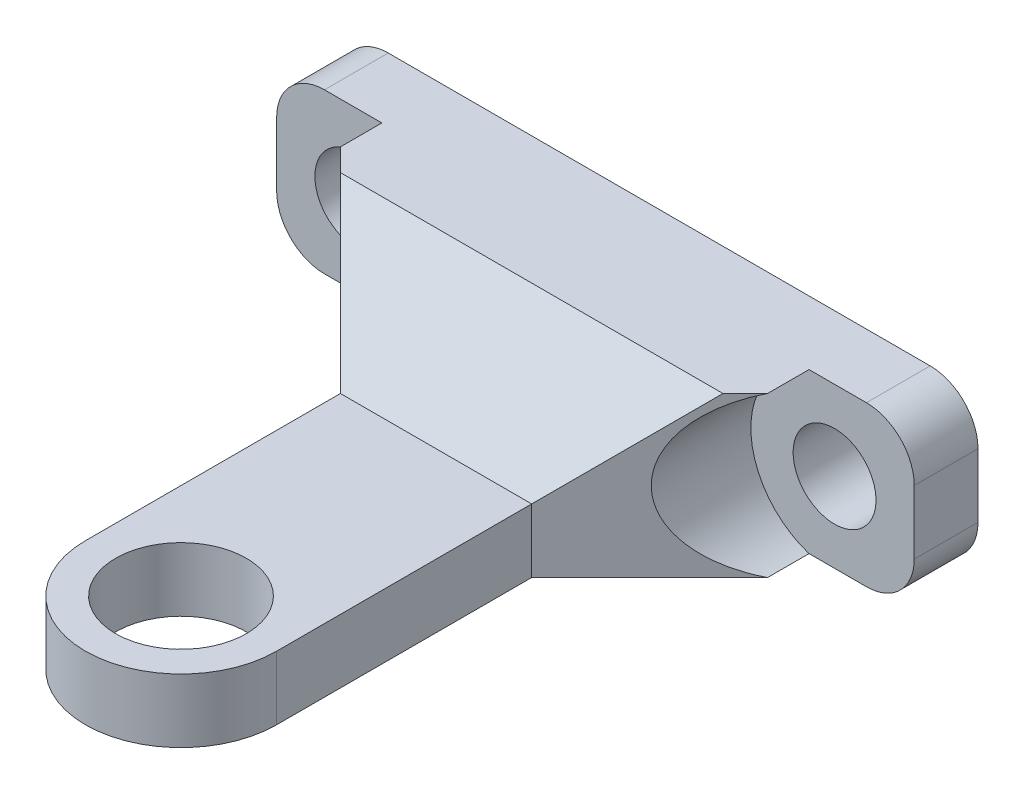
ISO-10303-21;
HEADER;
FILE_DESCRIPTION(('STEP AP214'),'2;1');
FILE_NAME('part.step','',(''),(''),'','','');
FILE_SCHEMA(('AUTOMOTIVE_DESIGN { 1 0 10303 214 1 1 1 1 }'));
ENDSEC;
DATA;
#1=APPLICATION_CONTEXT('core data for automotive mechanical design processes');
#2=APPLICATION_PROTOCOL_DEFINITION('international standard','automotive_design',2000,#1);
#3=PRODUCT_CONTEXT('',#1,'mechanical');
#4=PRODUCT('Part','Part','',(#3));
#5=PRODUCT_RELATED_PRODUCT_CATEGORY('part','',(#4));
#6=PRODUCT_DEFINITION_FORMATION('','',#4);
#7=PRODUCT_DEFINITION_CONTEXT('part definition',#1,'design');
#8=PRODUCT_DEFINITION('design','',#6,#7);
#9=PRODUCT_DEFINITION_SHAPE('','',#8);
#10=(LENGTH_UNIT() NAMED_UNIT(*) SI_UNIT(.MILLI.,.METRE.));
#11=(NAMED_UNIT(*) PLANE_ANGLE_UNIT() SI_UNIT($,.RADIAN.));
#12=(NAMED_UNIT(*) SI_UNIT($,.STERADIAN.) SOLID_ANGLE_UNIT());
#13=UNCERTAINTY_MEASURE_WITH_UNIT(LENGTH_MEASURE(1.E-05),#10,'distance_accuracy_value','');
#14=(GEOMETRIC_REPRESENTATION_CONTEXT(3) GLOBAL_UNCERTAINTY_ASSIGNED_CONTEXT((#13)) GLOBAL_UNIT_ASSIGNED_CONTEXT((#10,
#11,#12)) REPRESENTATION_CONTEXT('',''));
#15=CARTESIAN_POINT('',(0.,0.,0.));
#16=DIRECTION('',(0.,0.,1.));
#17=DIRECTION('',(1.,0.,0.));
#18=AXIS2_PLACEMENT_3D('',#15,#16,#17);
#19=CARTESIAN_POINT('',(15.,3.,-18.));
#20=DIRECTION('',(0.,0.,1.));
#21=DIRECTION('',(1.,0.,0.));
#22=AXIS2_PLACEMENT_3D('',#19,#20,#21);
#23=CYLINDRICAL_SURFACE('',#22,2.6);
#24=CARTESIAN_POINT('',(15.,3.,-18.));
#25=DIRECTION('',(0.,0.,-1.));
#26=DIRECTION('',(-1.,0.,0.));
#27=AXIS2_PLACEMENT_3D('',#24,#25,#26);
#28=CIRCLE('',#27,2.6);
#29=CARTESIAN_POINT('',(12.4,3.,-18.));
#30=VERTEX_POINT('',#29);
#31=EDGE_CURVE('E182',#30,#30,#28,.T.);
#32=ORIENTED_EDGE('',*,*,#31,.T.);
#33=EDGE_LOOP('',(#32));
#34=FACE_BOUND('',#33,.T.);
#35=CARTESIAN_POINT('',(15.,3.,-14.));
#36=DIRECTION('',(0.,0.,-1.));
#37=DIRECTION('',(-1.,0.,0.));
#38=AXIS2_PLACEMENT_3D('',#35,#36,#37);
#39=CIRCLE('',#38,2.6);
#40=CARTESIAN_POINT('',(12.4,3.,-14.));
#41=VERTEX_POINT('',#40);
#42=EDGE_CURVE('E187',#41,#41,#39,.F.);
#43=ORIENTED_EDGE('',*,*,#42,.T.);
#44=EDGE_LOOP('',(#43));
#45=FACE_BOUND('',#44,.T.);
#46=ADVANCED_FACE('F35',(#34,#45),#23,.F.);
#47=CARTESIAN_POINT('',(0.,-2.,0.));
#48=DIRECTION('',(0.,1.,0.));
#49=DIRECTION('',(0.,0.,1.));
#50=AXIS2_PLACEMENT_3D('',#47,#48,#49);
#51=PLANE('',#50);
#52=CARTESIAN_POINT('',(0.,-2.,12.));
#53=DIRECTION('',(0.,1.,0.));
#54=DIRECTION('',(0.,0.,1.));
#55=AXIS2_PLACEMENT_3D('',#52,#53,#54);
#56=CIRCLE('',#55,4.1);
#57=CARTESIAN_POINT('',(0.,-2.,16.1));
#58=VERTEX_POINT('',#57);
#59=EDGE_CURVE('E211',#58,#58,#56,.T.);
#60=ORIENTED_EDGE('',*,*,#59,.T.);
#61=EDGE_LOOP('',(#60));
#62=FACE_BOUND('',#61,.T.);
#63=DIRECTION('',(1.,0.,0.));
#64=VECTOR('',#63,1.);
#65=CARTESIAN_POINT('',(0.,-2.,-18.));
#66=LINE('',#65,#64);
#67=CARTESIAN_POINT('',(-17.,-2.,-18.));
#68=VERTEX_POINT('',#67);
#69=CARTESIAN_POINT('',(17.,-2.,-18.));
#70=VERTEX_POINT('',#69);
#71=EDGE_CURVE('E230',#68,#70,#66,.T.);
#72=ORIENTED_EDGE('',*,*,#71,.T.);
#73=DIRECTION('',(0.,0.,1.));
#74=VECTOR('',#73,1.);
#75=CARTESIAN_POINT('',(17.,-2.,-14.));
#76=LINE('',#75,#74);
#77=CARTESIAN_POINT('',(17.,-2.,-14.));
#78=VERTEX_POINT('',#77);
#79=EDGE_CURVE('E280',#70,#78,#76,.T.);
#80=ORIENTED_EDGE('',*,*,#79,.T.);
#81=DIRECTION('',(1.,0.,0.));
#82=VECTOR('',#81,1.);
#83=CARTESIAN_POINT('',(0.,-2.,-14.));
#84=LINE('',#83,#82);
#85=CARTESIAN_POINT('',(13.3992189406418,-2.,-14.));
#86=VERTEX_POINT('',#85);
#87=EDGE_CURVE('E222',#86,#78,#84,.T.);
#88=ORIENTED_EDGE('',*,*,#87,.F.);
#89=DIRECTION('',(0.,0.,-1.));
#90=VECTOR('',#89,1.);
#91=CARTESIAN_POINT('',(13.3992189406418,-2.,18.));
#92=LINE('',#91,#90);
#93=CARTESIAN_POINT('',(13.3992189406418,-2.,-11.3992189406418));
#94=VERTEX_POINT('',#93);
#95=EDGE_CURVE('E175',#86,#94,#92,.F.);
#96=ORIENTED_EDGE('',*,*,#95,.T.);
#97=DIRECTION('',(0.707106781186551,0.,-0.707106781186544));
#98=VECTOR('',#97,1.);
#99=CARTESIAN_POINT('',(0.999999999999946,-2.,0.999999999999956));
#100=LINE('',#99,#98);
#101=CARTESIAN_POINT('',(6.,-2.,-4.00000000000005));
#102=VERTEX_POINT('',#101);
#103=EDGE_CURVE('E253',#94,#102,#100,.F.);
#104=ORIENTED_EDGE('',*,*,#103,.T.);
#105=DIRECTION('',(0.,0.,-1.));
#106=VECTOR('',#105,1.);
#107=CARTESIAN_POINT('',(6.,-2.,0.));
#108=LINE('',#107,#106);
#109=CARTESIAN_POINT('',(6.,-2.,12.));
#110=VERTEX_POINT('',#109);
#111=EDGE_CURVE('E227',#110,#102,#108,.T.);
#112=ORIENTED_EDGE('',*,*,#111,.F.);
#113=CARTESIAN_POINT('',(0.,-2.,12.));
#114=DIRECTION('',(0.,1.,0.));
#115=DIRECTION('',(0.,0.,1.));
#116=AXIS2_PLACEMENT_3D('',#113,#114,#115);
#117=CIRCLE('',#116,6.);
#118=CARTESIAN_POINT('',(-6.,-2.,12.));
#119=VERTEX_POINT('',#118);
#120=EDGE_CURVE('E225',#119,#110,#117,.T.);
#121=ORIENTED_EDGE('',*,*,#120,.F.);
#122=DIRECTION('',(0.,0.,-1.));
#123=VECTOR('',#122,1.);
#124=CARTESIAN_POINT('',(-6.,-2.,0.));
#125=LINE('',#124,#123);
#126=CARTESIAN_POINT('',(-6.,-2.,-4.00000000000003));
#127=VERTEX_POINT('',#126);
#128=EDGE_CURVE('E221',#119,#127,#125,.T.);
#129=ORIENTED_EDGE('',*,*,#128,.T.);
#130=DIRECTION('',(-0.707106781186551,0.,-0.707106781186544));
#131=VECTOR('',#130,1.);
#132=CARTESIAN_POINT('',(-0.999999999999952,-2.,0.999999999999962));
#133=LINE('',#132,#131);
#134=CARTESIAN_POINT('',(-13.3992189406418,-2.,-11.3992189406418));
#135=VERTEX_POINT('',#134);
#136=EDGE_CURVE('E258',#127,#135,#133,.T.);
#137=ORIENTED_EDGE('',*,*,#136,.T.);
#138=DIRECTION('',(0.,0.,-1.));
#139=VECTOR('',#138,1.);
#140=CARTESIAN_POINT('',(-13.3992189406418,-2.,18.));
#141=LINE('',#140,#139);
#142=CARTESIAN_POINT('',(-13.3992189406418,-2.,-14.));
#143=VERTEX_POINT('',#142);
#144=EDGE_CURVE('E196',#143,#135,#141,.F.);
#145=ORIENTED_EDGE('',*,*,#144,.F.);
#146=CARTESIAN_POINT('',(-17.,-2.,-14.));
#147=VERTEX_POINT('',#146);
#148=EDGE_CURVE('E206',#147,#143,#84,.T.);
#149=ORIENTED_EDGE('',*,*,#148,.F.);
#150=DIRECTION('',(0.,0.,1.));
#151=VECTOR('',#150,1.);
#152=CARTESIAN_POINT('',(-17.,-2.,0.));
#153=LINE('',#152,#151);
#154=EDGE_CURVE('E278',#147,#68,#153,.F.);
#155=ORIENTED_EDGE('',*,*,#154,.T.);
#156=EDGE_LOOP('',(#72,#80,#88,#96,#104,#112,#121,#129,#137,#145,#149,#155));
#157=FACE_BOUND('',#156,.T.);
#158=ADVANCED_FACE('F317',(#62,#157),#51,.F.);
#159=CARTESIAN_POINT('',(0.,8.,0.));
#160=DIRECTION('',(0.,1.,0.));
#161=DIRECTION('',(0.,0.,1.));
#162=AXIS2_PLACEMENT_3D('',#159,#160,#161);
#163=PLANE('',#162);
#164=DIRECTION('',(1.,0.,0.));
#165=VECTOR('',#164,1.);
#166=CARTESIAN_POINT('',(-20.,8.,-14.));
#167=LINE('',#166,#165);
#168=CARTESIAN_POINT('',(13.3992189406418,8.,-14.));
#169=VERTEX_POINT('',#168);
#170=CARTESIAN_POINT('',(17.,8.,-14.));
#171=VERTEX_POINT('',#170);
#172=EDGE_CURVE('E153',#169,#171,#167,.T.);
#173=ORIENTED_EDGE('',*,*,#172,.T.);
#174=DIRECTION('',(0.,0.,-1.));
#175=VECTOR('',#174,1.);
#176=CARTESIAN_POINT('',(17.,8.,0.));
#177=LINE('',#176,#175);
#178=CARTESIAN_POINT('',(17.,8.,-18.));
#179=VERTEX_POINT('',#178);
#180=EDGE_CURVE('E301',#171,#179,#177,.T.);
#181=ORIENTED_EDGE('',*,*,#180,.T.);
#182=DIRECTION('',(-1.,0.,0.));
#183=VECTOR('',#182,1.);
#184=CARTESIAN_POINT('',(-20.,8.,-18.));
#185=LINE('',#184,#183);
#186=CARTESIAN_POINT('',(-17.,8.,-18.));
#187=VERTEX_POINT('',#186);
#188=EDGE_CURVE('E203',#179,#187,#185,.T.);
#189=ORIENTED_EDGE('',*,*,#188,.T.);
#190=DIRECTION('',(0.,0.,1.));
#191=VECTOR('',#190,1.);
#192=CARTESIAN_POINT('',(-17.,8.,-14.));
#193=LINE('',#192,#191);
#194=CARTESIAN_POINT('',(-17.,8.,-14.));
#195=VERTEX_POINT('',#194);
#196=EDGE_CURVE('E298',#187,#195,#193,.T.);
#197=ORIENTED_EDGE('',*,*,#196,.T.);
#198=CARTESIAN_POINT('',(-13.3992189406418,8.,-14.));
#199=VERTEX_POINT('',#198);
#200=EDGE_CURVE('E166',#195,#199,#167,.T.);
#201=ORIENTED_EDGE('',*,*,#200,.T.);
#202=DIRECTION('',(0.,0.,-1.));
#203=VECTOR('',#202,1.);
#204=CARTESIAN_POINT('',(-13.3992189406418,8.,18.));
#205=LINE('',#204,#203);
#206=CARTESIAN_POINT('',(-13.3992189406418,8.,-11.3992189406418));
#207=VERTEX_POINT('',#206);
#208=EDGE_CURVE('E193',#199,#207,#205,.F.);
#209=ORIENTED_EDGE('',*,*,#208,.T.);
#210=DIRECTION('',(0.707106781186551,0.,0.707106781186544));
#211=VECTOR('',#210,1.);
#212=CARTESIAN_POINT('',(-6.,8.,-4.00000000000003));
#213=LINE('',#212,#211);
#214=CARTESIAN_POINT('',(-11.9999999999999,8.,-9.99999999999987));
#215=VERTEX_POINT('',#214);
#216=EDGE_CURVE('E271',#207,#215,#213,.T.);
#217=ORIENTED_EDGE('',*,*,#216,.T.);
#218=DIRECTION('',(1.,0.,0.));
#219=VECTOR('',#218,1.);
#220=CARTESIAN_POINT('',(0.,8.,-9.99999999999987));
#221=LINE('',#220,#219);
#222=CARTESIAN_POINT('',(11.9999999999999,8.,-9.99999999999987));
#223=VERTEX_POINT('',#222);
#224=EDGE_CURVE('E264',#215,#223,#221,.T.);
#225=ORIENTED_EDGE('',*,*,#224,.T.);
#226=DIRECTION('',(-0.707106781186551,0.,0.707106781186544));
#227=VECTOR('',#226,1.);
#228=CARTESIAN_POINT('',(16.0000000000001,8.,-14.));
#229=LINE('',#228,#227);
#230=CARTESIAN_POINT('',(13.3992189406418,8.,-11.3992189406418));
#231=VERTEX_POINT('',#230);
#232=EDGE_CURVE('E180',#231,#223,#229,.T.);
#233=ORIENTED_EDGE('',*,*,#232,.F.);
#234=DIRECTION('',(0.,0.,-1.));
#235=VECTOR('',#234,1.);
#236=CARTESIAN_POINT('',(13.3992189406418,8.,18.));
#237=LINE('',#236,#235);
#238=EDGE_CURVE('E172',#169,#231,#237,.F.);
#239=ORIENTED_EDGE('',*,*,#238,.F.);
#240=EDGE_LOOP('',(#173,#181,#189,#197,#201,#209,#217,#225,#233,#239));
#241=FACE_BOUND('',#240,.T.);
#242=ADVANCED_FACE('F178',(#241),#163,.T.);
#243=CARTESIAN_POINT('',(-6.,2.,-4.00000000000003));
#244=DIRECTION('',(0.707106781186544,0.,-0.707106781186551));
#245=DIRECTION('',(0.,-1.,0.));
#246=AXIS2_PLACEMENT_3D('',#243,#244,#245);
#247=PLANE('',#246);
#248=CARTESIAN_POINT('',(-15.,3.,-12.9999999999999));
#249=DIRECTION('',(0.707106781186544,0.,-0.707106781186551));
#250=DIRECTION('',(-0.707106781186551,0.,-0.707106781186544));
#251=AXIS2_PLACEMENT_3D('',#248,#249,#250);
#252=ELLIPSE('',#251,7.42462120245871,5.25);
#253=EDGE_CURVE('E273',#135,#207,#252,.F.);
#254=ORIENTED_EDGE('',*,*,#253,.F.);
#255=ORIENTED_EDGE('',*,*,#136,.F.);
#256=DIRECTION('',(0.,-1.,0.));
#257=VECTOR('',#256,1.);
#258=CARTESIAN_POINT('',(-6.,2.,-4.00000000000003));
#259=LINE('',#258,#257);
#260=CARTESIAN_POINT('',(-6.,2.,-4.00000000000003));
#261=VERTEX_POINT('',#260);
#262=EDGE_CURVE('E255',#261,#127,#259,.T.);
#263=ORIENTED_EDGE('',*,*,#262,.F.);
#264=DIRECTION('',(-0.577350269189628,0.577350269189628,-0.577350269189622));
#265=VECTOR('',#264,1.);
#266=CARTESIAN_POINT('',(-5.99999999999996,2.00000000000007,-4.));
#267=LINE('',#266,#265);
#268=EDGE_CURVE('E268',#261,#215,#267,.T.);
#269=ORIENTED_EDGE('',*,*,#268,.T.);
#270=ORIENTED_EDGE('',*,*,#216,.F.);
#271=EDGE_LOOP('',(#254,#255,#263,#269,#270));
#272=FACE_BOUND('',#271,.T.);
#273=ADVANCED_FACE('F343',(#272),#247,.F.);
#274=CARTESIAN_POINT('',(-15.,3.,-18.));
#275=DIRECTION('',(0.,0.,1.));
#276=DIRECTION('',(1.,0.,0.));
#277=AXIS2_PLACEMENT_3D('',#274,#275,#276);
#278=CYLINDRICAL_SURFACE('',#277,2.6);
#279=CARTESIAN_POINT('',(-15.,3.,-18.));
#280=DIRECTION('',(0.,0.,1.));
#281=DIRECTION('',(1.,0.,0.));
#282=AXIS2_PLACEMENT_3D('',#279,#280,#281);
#283=CIRCLE('',#282,2.6);
#284=CARTESIAN_POINT('',(-12.4,3.,-18.));
#285=VERTEX_POINT('',#284);
#286=EDGE_CURVE('E198',#285,#285,#283,.T.);
#287=ORIENTED_EDGE('',*,*,#286,.F.);
#288=EDGE_LOOP('',(#287));
#289=FACE_BOUND('',#288,.T.);
#290=CARTESIAN_POINT('',(-15.,3.,-14.));
#291=DIRECTION('',(0.,0.,-1.));
#292=DIRECTION('',(-1.,0.,0.));
#293=AXIS2_PLACEMENT_3D('',#290,#291,#292);
#294=CIRCLE('',#293,2.6);
#295=CARTESIAN_POINT('',(-17.6,3.,-14.));
#296=VERTEX_POINT('',#295);
#297=EDGE_CURVE('E167',#296,#296,#294,.T.);
#298=ORIENTED_EDGE('',*,*,#297,.F.);
#299=EDGE_LOOP('',(#298));
#300=FACE_BOUND('',#299,.T.);
#301=ADVANCED_FACE('F391',(#289,#300),#278,.F.);
#302=CARTESIAN_POINT('',(0.,2.,-14.));
#303=DIRECTION('',(0.,0.,-1.));
#304=DIRECTION('',(-1.,0.,0.));
#305=AXIS2_PLACEMENT_3D('',#302,#303,#304);
#306=PLANE('',#305);
#307=ORIENTED_EDGE('',*,*,#87,.T.);
#308=CARTESIAN_POINT('',(17.,1.,-14.));
#309=DIRECTION('',(0.,0.,-1.));
#310=DIRECTION('',(-1.,0.,0.));
#311=AXIS2_PLACEMENT_3D('',#308,#309,#310);
#312=CIRCLE('',#311,3.);
#313=CARTESIAN_POINT('',(20.,1.,-14.));
#314=VERTEX_POINT('',#313);
#315=EDGE_CURVE('E284',#78,#314,#312,.F.);
#316=ORIENTED_EDGE('',*,*,#315,.T.);
#317=DIRECTION('',(0.,-1.,0.));
#318=VECTOR('',#317,1.);
#319=CARTESIAN_POINT('',(20.,2.,-14.));
#320=LINE('',#319,#318);
#321=CARTESIAN_POINT('',(20.,5.,-14.));
#322=VERTEX_POINT('',#321);
#323=EDGE_CURVE('E240',#322,#314,#320,.T.);
#324=ORIENTED_EDGE('',*,*,#323,.F.);
#325=CARTESIAN_POINT('',(17.,5.,-14.));
#326=DIRECTION('',(0.,0.,-1.));
#327=DIRECTION('',(-1.,0.,0.));
#328=AXIS2_PLACEMENT_3D('',#325,#326,#327);
#329=CIRCLE('',#328,3.);
#330=EDGE_CURVE('E161',#322,#171,#329,.F.);
#331=ORIENTED_EDGE('',*,*,#330,.T.);
#332=ORIENTED_EDGE('',*,*,#172,.F.);
#333=CARTESIAN_POINT('',(15.,3.,-14.));
#334=DIRECTION('',(0.,0.,-1.));
#335=DIRECTION('',(-1.,0.,0.));
#336=AXIS2_PLACEMENT_3D('',#333,#334,#335);
#337=CIRCLE('',#336,5.25);
#338=EDGE_CURVE('E158',#86,#169,#337,.T.);
#339=ORIENTED_EDGE('',*,*,#338,.F.);
#340=EDGE_LOOP('',(#307,#316,#324,#331,#332,#339));
#341=FACE_BOUND('',#340,.T.);
#342=ORIENTED_EDGE('',*,*,#42,.F.);
#343=EDGE_LOOP('',(#342));
#344=FACE_BOUND('',#343,.T.);
#345=ADVANCED_FACE('F156',(#341,#344),#306,.F.);
#346=CARTESIAN_POINT('',(-20.,2.,0.));
#347=DIRECTION('',(1.,0.,0.));
#348=DIRECTION('',(0.,0.,-1.));
#349=AXIS2_PLACEMENT_3D('',#346,#347,#348);
#350=PLANE('',#349);
#351=DIRECTION('',(0.,-1.,0.));
#352=VECTOR('',#351,1.);
#353=CARTESIAN_POINT('',(-20.,2.,-18.));
#354=LINE('',#353,#352);
#355=CARTESIAN_POINT('',(-20.,5.,-18.));
#356=VERTEX_POINT('',#355);
#357=CARTESIAN_POINT('',(-20.,1.,-18.));
#358=VERTEX_POINT('',#357);
#359=EDGE_CURVE('E219',#356,#358,#354,.T.);
#360=ORIENTED_EDGE('',*,*,#359,.T.);
#361=DIRECTION('',(0.,0.,1.));
#362=VECTOR('',#361,1.);
#363=CARTESIAN_POINT('',(-20.,1.,0.));
#364=LINE('',#363,#362);
#365=CARTESIAN_POINT('',(-20.,1.,-14.));
#366=VERTEX_POINT('',#365);
#367=EDGE_CURVE('E305',#358,#366,#364,.T.);
#368=ORIENTED_EDGE('',*,*,#367,.T.);
#369=DIRECTION('',(0.,-1.,0.));
#370=VECTOR('',#369,1.);
#371=CARTESIAN_POINT('',(-20.,2.,-14.));
#372=LINE('',#371,#370);
#373=CARTESIAN_POINT('',(-20.,5.,-14.));
#374=VERTEX_POINT('',#373);
#375=EDGE_CURVE('E248',#374,#366,#372,.T.);
#376=ORIENTED_EDGE('',*,*,#375,.F.);
#377=DIRECTION('',(0.,0.,1.));
#378=VECTOR('',#377,1.);
#379=CARTESIAN_POINT('',(-20.,5.,-18.));
#380=LINE('',#379,#378);
#381=EDGE_CURVE('E303',#374,#356,#380,.F.);
#382=ORIENTED_EDGE('',*,*,#381,.T.);
#383=EDGE_LOOP('',(#360,#368,#376,#382));
#384=FACE_BOUND('',#383,.T.);
#385=ADVANCED_FACE('F307',(#384),#350,.F.);
#386=CARTESIAN_POINT('',(-6.,2.,0.));
#387=DIRECTION('',(-1.,0.,0.));
#388=DIRECTION('',(0.,0.,1.));
#389=AXIS2_PLACEMENT_3D('',#386,#387,#388);
#390=PLANE('',#389);
#391=DIRECTION('',(0.,0.,-1.));
#392=VECTOR('',#391,1.);
#393=CARTESIAN_POINT('',(-6.,2.,0.));
#394=LINE('',#393,#392);
#395=CARTESIAN_POINT('',(-6.,2.,12.));
#396=VERTEX_POINT('',#395);
#397=EDGE_CURVE('E207',#396,#261,#394,.T.);
#398=ORIENTED_EDGE('',*,*,#397,.T.);
#399=ORIENTED_EDGE('',*,*,#262,.T.);
#400=ORIENTED_EDGE('',*,*,#128,.F.);
#401=DIRECTION('',(0.,-1.,0.));
#402=VECTOR('',#401,1.);
#403=CARTESIAN_POINT('',(-6.,2.,12.));
#404=LINE('',#403,#402);
#405=EDGE_CURVE('E246',#396,#119,#404,.T.);
#406=ORIENTED_EDGE('',*,*,#405,.F.);
#407=EDGE_LOOP('',(#398,#399,#400,#406));
#408=FACE_BOUND('',#407,.T.);
#409=ADVANCED_FACE('F369',(#408),#390,.T.);
#410=CARTESIAN_POINT('',(0.,2.,12.));
#411=DIRECTION('',(0.,-1.,0.));
#412=DIRECTION('',(0.,0.,-1.));
#413=AXIS2_PLACEMENT_3D('',#410,#411,#412);
#414=CYLINDRICAL_SURFACE('',#413,6.);
#415=ORIENTED_EDGE('',*,*,#120,.T.);
#416=DIRECTION('',(0.,-1.,0.));
#417=VECTOR('',#416,1.);
#418=CARTESIAN_POINT('',(6.,2.,12.));
#419=LINE('',#418,#417);
#420=CARTESIAN_POINT('',(6.,2.,12.));
#421=VERTEX_POINT('',#420);
#422=EDGE_CURVE('E243',#421,#110,#419,.T.);
#423=ORIENTED_EDGE('',*,*,#422,.F.);
#424=CARTESIAN_POINT('',(0.,2.,12.));
#425=DIRECTION('',(0.,1.,0.));
#426=DIRECTION('',(0.,0.,1.));
#427=AXIS2_PLACEMENT_3D('',#424,#425,#426);
#428=CIRCLE('',#427,6.);
#429=EDGE_CURVE('E210',#396,#421,#428,.T.);
#430=ORIENTED_EDGE('',*,*,#429,.F.);
#431=ORIENTED_EDGE('',*,*,#405,.T.);
#432=EDGE_LOOP('',(#415,#423,#430,#431));
#433=FACE_BOUND('',#432,.T.);
#434=ADVANCED_FACE('F365',(#433),#414,.T.);
#435=CARTESIAN_POINT('',(6.,2.,0.));
#436=DIRECTION('',(-1.,0.,0.));
#437=DIRECTION('',(0.,0.,1.));
#438=AXIS2_PLACEMENT_3D('',#435,#436,#437);
#439=PLANE('',#438);
#440=ORIENTED_EDGE('',*,*,#111,.T.);
#441=DIRECTION('',(0.,1.,0.));
#442=VECTOR('',#441,1.);
#443=CARTESIAN_POINT('',(6.,2.,-4.00000000000005));
#444=LINE('',#443,#442);
#445=CARTESIAN_POINT('',(6.,2.,-4.00000000000005));
#446=VERTEX_POINT('',#445);
#447=EDGE_CURVE('E250',#102,#446,#444,.T.);
#448=ORIENTED_EDGE('',*,*,#447,.T.);
#449=DIRECTION('',(0.,0.,-1.));
#450=VECTOR('',#449,1.);
#451=CARTESIAN_POINT('',(6.,2.,0.));
#452=LINE('',#451,#450);
#453=EDGE_CURVE('E213',#421,#446,#452,.T.);
#454=ORIENTED_EDGE('',*,*,#453,.F.);
#455=ORIENTED_EDGE('',*,*,#422,.T.);
#456=EDGE_LOOP('',(#440,#448,#454,#455));
#457=FACE_BOUND('',#456,.T.);
#458=ADVANCED_FACE('F356',(#457),#439,.F.);
#459=ORIENTED_EDGE('',*,*,#375,.T.);
#460=CARTESIAN_POINT('',(-17.,1.,-14.));
#461=DIRECTION('',(0.,0.,-1.));
#462=DIRECTION('',(-1.,0.,0.));
#463=AXIS2_PLACEMENT_3D('',#460,#461,#462);
#464=CIRCLE('',#463,3.);
#465=EDGE_CURVE('E11',#366,#147,#464,.F.);
#466=ORIENTED_EDGE('',*,*,#465,.T.);
#467=ORIENTED_EDGE('',*,*,#148,.T.);
#468=CARTESIAN_POINT('',(-15.,3.,-14.));
#469=DIRECTION('',(0.,0.,1.));
#470=DIRECTION('',(1.,0.,0.));
#471=AXIS2_PLACEMENT_3D('',#468,#469,#470);
#472=CIRCLE('',#471,5.25);
#473=EDGE_CURVE('E190',#143,#199,#472,.T.);
#474=ORIENTED_EDGE('',*,*,#473,.T.);
#475=ORIENTED_EDGE('',*,*,#200,.F.);
#476=CARTESIAN_POINT('',(-17.,5.,-14.));
#477=DIRECTION('',(0.,0.,-1.));
#478=DIRECTION('',(-1.,0.,0.));
#479=AXIS2_PLACEMENT_3D('',#476,#477,#478);
#480=CIRCLE('',#479,3.);
#481=EDGE_CURVE('E43',#195,#374,#480,.F.);
#482=ORIENTED_EDGE('',*,*,#481,.T.);
#483=EDGE_LOOP('',(#459,#466,#467,#474,#475,#482));
#484=FACE_BOUND('',#483,.T.);
#485=ORIENTED_EDGE('',*,*,#297,.T.);
#486=EDGE_LOOP('',(#485));
#487=FACE_BOUND('',#486,.T.);
#488=ADVANCED_FACE('F311',(#484,#487),#306,.F.);
#489=CARTESIAN_POINT('',(20.,2.,0.));
#490=DIRECTION('',(1.,0.,0.));
#491=DIRECTION('',(0.,0.,-1.));
#492=AXIS2_PLACEMENT_3D('',#489,#490,#491);
#493=PLANE('',#492);
#494=ORIENTED_EDGE('',*,*,#323,.T.);
#495=DIRECTION('',(0.,0.,1.));
#496=VECTOR('',#495,1.);
#497=CARTESIAN_POINT('',(20.,1.,-18.));
#498=LINE('',#497,#496);
#499=CARTESIAN_POINT('',(20.,1.,-18.));
#500=VERTEX_POINT('',#499);
#501=EDGE_CURVE('E288',#314,#500,#498,.F.);
#502=ORIENTED_EDGE('',*,*,#501,.T.);
#503=DIRECTION('',(0.,-1.,0.));
#504=VECTOR('',#503,1.);
#505=CARTESIAN_POINT('',(20.,2.,-18.));
#506=LINE('',#505,#504);
#507=CARTESIAN_POINT('',(20.,5.,-18.));
#508=VERTEX_POINT('',#507);
#509=EDGE_CURVE('E237',#508,#500,#506,.T.);
#510=ORIENTED_EDGE('',*,*,#509,.F.);
#511=DIRECTION('',(0.,0.,-1.));
#512=VECTOR('',#511,1.);
#513=CARTESIAN_POINT('',(20.,5.,0.));
#514=LINE('',#513,#512);
#515=EDGE_CURVE('E286',#508,#322,#514,.F.);
#516=ORIENTED_EDGE('',*,*,#515,.T.);
#517=EDGE_LOOP('',(#494,#502,#510,#516));
#518=FACE_BOUND('',#517,.T.);
#519=ADVANCED_FACE('F329',(#518),#493,.T.);
#520=CARTESIAN_POINT('',(0.,2.,-18.));
#521=DIRECTION('',(0.,0.,-1.));
#522=DIRECTION('',(-1.,0.,0.));
#523=AXIS2_PLACEMENT_3D('',#520,#521,#522);
#524=PLANE('',#523);
#525=ORIENTED_EDGE('',*,*,#31,.F.);
#526=EDGE_LOOP('',(#525));
#527=FACE_BOUND('',#526,.T.);
#528=ORIENTED_EDGE('',*,*,#286,.T.);
#529=EDGE_LOOP('',(#528));
#530=FACE_BOUND('',#529,.T.);
#531=ORIENTED_EDGE('',*,*,#509,.T.);
#532=CARTESIAN_POINT('',(17.,1.,-18.));
#533=DIRECTION('',(0.,0.,-1.));
#534=DIRECTION('',(-1.,0.,0.));
#535=AXIS2_PLACEMENT_3D('',#532,#533,#534);
#536=CIRCLE('',#535,3.);
#537=EDGE_CURVE('E296',#500,#70,#536,.T.);
#538=ORIENTED_EDGE('',*,*,#537,.T.);
#539=ORIENTED_EDGE('',*,*,#71,.F.);
#540=CARTESIAN_POINT('',(-17.,1.,-18.));
#541=DIRECTION('',(0.,0.,-1.));
#542=DIRECTION('',(-1.,0.,0.));
#543=AXIS2_PLACEMENT_3D('',#540,#541,#542);
#544=CIRCLE('',#543,3.);
#545=EDGE_CURVE('E292',#68,#358,#544,.T.);
#546=ORIENTED_EDGE('',*,*,#545,.T.);
#547=ORIENTED_EDGE('',*,*,#359,.F.);
#548=CARTESIAN_POINT('',(-17.,5.,-18.));
#549=DIRECTION('',(0.,0.,-1.));
#550=DIRECTION('',(-1.,0.,0.));
#551=AXIS2_PLACEMENT_3D('',#548,#549,#550);
#552=CIRCLE('',#551,3.);
#553=EDGE_CURVE('E290',#356,#187,#552,.T.);
#554=ORIENTED_EDGE('',*,*,#553,.T.);
#555=ORIENTED_EDGE('',*,*,#188,.F.);
#556=CARTESIAN_POINT('',(17.,5.,-18.));
#557=DIRECTION('',(0.,0.,-1.));
#558=DIRECTION('',(-1.,0.,0.));
#559=AXIS2_PLACEMENT_3D('',#556,#557,#558);
#560=CIRCLE('',#559,3.);
#561=EDGE_CURVE('E294',#179,#508,#560,.T.);
#562=ORIENTED_EDGE('',*,*,#561,.T.);
#563=EDGE_LOOP('',(#531,#538,#539,#546,#547,#554,#555,#562));
#564=FACE_BOUND('',#563,.T.);
#565=ADVANCED_FACE('F321',(#527,#530,#564),#524,.T.);
#566=CARTESIAN_POINT('',(0.,2.,12.));
#567=DIRECTION('',(0.,-1.,0.));
#568=DIRECTION('',(0.,0.,-1.));
#569=AXIS2_PLACEMENT_3D('',#566,#567,#568);
#570=CYLINDRICAL_SURFACE('',#569,4.1);
#571=CARTESIAN_POINT('',(0.,2.,12.));
#572=DIRECTION('',(0.,1.,0.));
#573=DIRECTION('',(0.,0.,1.));
#574=AXIS2_PLACEMENT_3D('',#571,#572,#573);
#575=CIRCLE('',#574,4.1);
#576=CARTESIAN_POINT('',(0.,2.,16.1));
#577=VERTEX_POINT('',#576);
#578=EDGE_CURVE('E216',#577,#577,#575,.T.);
#579=ORIENTED_EDGE('',*,*,#578,.T.);
#580=EDGE_LOOP('',(#579));
#581=FACE_BOUND('',#580,.T.);
#582=ORIENTED_EDGE('',*,*,#59,.F.);
#583=EDGE_LOOP('',(#582));
#584=FACE_BOUND('',#583,.T.);
#585=ADVANCED_FACE('F398',(#581,#584),#570,.F.);
#586=CARTESIAN_POINT('',(0.,2.,0.));
#587=DIRECTION('',(0.,1.,0.));
#588=DIRECTION('',(0.,0.,1.));
#589=AXIS2_PLACEMENT_3D('',#586,#587,#588);
#590=PLANE('',#589);
#591=ORIENTED_EDGE('',*,*,#453,.T.);
#592=DIRECTION('',(-1.,0.,0.));
#593=VECTOR('',#592,1.);
#594=CARTESIAN_POINT('',(0.,2.,-3.99999999999993));
#595=LINE('',#594,#593);
#596=EDGE_CURVE('E261',#446,#261,#595,.T.);
#597=ORIENTED_EDGE('',*,*,#596,.T.);
#598=ORIENTED_EDGE('',*,*,#397,.F.);
#599=ORIENTED_EDGE('',*,*,#429,.T.);
#600=EDGE_LOOP('',(#591,#597,#598,#599));
#601=FACE_BOUND('',#600,.T.);
#602=ORIENTED_EDGE('',*,*,#578,.F.);
#603=EDGE_LOOP('',(#602));
#604=FACE_BOUND('',#603,.T.);
#605=ADVANCED_FACE('F359',(#601,#604),#590,.T.);
#606=CARTESIAN_POINT('',(16.0000000000001,2.,-14.));
#607=DIRECTION('',(0.707106781186544,0.,0.707106781186551));
#608=DIRECTION('',(0.,1.,0.));
#609=AXIS2_PLACEMENT_3D('',#606,#607,#608);
#610=PLANE('',#609);
#611=ORIENTED_EDGE('',*,*,#103,.F.);
#612=CARTESIAN_POINT('',(15.,3.,-12.9999999999999));
#613=DIRECTION('',(0.707106781186544,0.,0.707106781186551));
#614=DIRECTION('',(0.707106781186551,0.,-0.707106781186544));
#615=AXIS2_PLACEMENT_3D('',#612,#613,#614);
#616=ELLIPSE('',#615,7.42462120245871,5.25);
#617=EDGE_CURVE('E276',#94,#231,#616,.F.);
#618=ORIENTED_EDGE('',*,*,#617,.T.);
#619=ORIENTED_EDGE('',*,*,#232,.T.);
#620=DIRECTION('',(0.577350269189628,0.577350269189628,-0.577350269189622));
#621=VECTOR('',#620,1.);
#622=CARTESIAN_POINT('',(12.6666666666666,8.66666666666676,-10.6666666666666));
#623=LINE('',#622,#621);
#624=EDGE_CURVE('E266',#223,#446,#623,.F.);
#625=ORIENTED_EDGE('',*,*,#624,.T.);
#626=ORIENTED_EDGE('',*,*,#447,.F.);
#627=EDGE_LOOP('',(#611,#618,#619,#625,#626));
#628=FACE_BOUND('',#627,.T.);
#629=ADVANCED_FACE('F353',(#628),#610,.T.);
#630=CARTESIAN_POINT('',(0.,12.0000000000002,-14.));
#631=DIRECTION('',(0.,-0.707106781186544,-0.707106781186551));
#632=DIRECTION('',(1.,0.,0.));
#633=AXIS2_PLACEMENT_3D('',#630,#631,#632);
#634=PLANE('',#633);
#635=ORIENTED_EDGE('',*,*,#268,.F.);
#636=ORIENTED_EDGE('',*,*,#596,.F.);
#637=ORIENTED_EDGE('',*,*,#624,.F.);
#638=ORIENTED_EDGE('',*,*,#224,.F.);
#639=EDGE_LOOP('',(#635,#636,#637,#638));
#640=FACE_BOUND('',#639,.T.);
#641=ADVANCED_FACE('F349',(#640),#634,.F.);
#642=CARTESIAN_POINT('',(-15.,3.,18.));
#643=DIRECTION('',(0.,0.,-1.));
#644=DIRECTION('',(-1.,0.,0.));
#645=AXIS2_PLACEMENT_3D('',#642,#643,#644);
#646=CYLINDRICAL_SURFACE('',#645,5.25);
#647=ORIENTED_EDGE('',*,*,#144,.T.);
#648=ORIENTED_EDGE('',*,*,#253,.T.);
#649=ORIENTED_EDGE('',*,*,#208,.F.);
#650=ORIENTED_EDGE('',*,*,#473,.F.);
#651=EDGE_LOOP('',(#647,#648,#649,#650));
#652=FACE_BOUND('',#651,.T.);
#653=ADVANCED_FACE('F339',(#652),#646,.F.);
#654=CARTESIAN_POINT('',(15.,3.,18.));
#655=DIRECTION('',(0.,0.,-1.));
#656=DIRECTION('',(-1.,0.,0.));
#657=AXIS2_PLACEMENT_3D('',#654,#655,#656);
#658=CYLINDRICAL_SURFACE('',#657,5.25);
#659=ORIENTED_EDGE('',*,*,#338,.T.);
#660=ORIENTED_EDGE('',*,*,#238,.T.);
#661=ORIENTED_EDGE('',*,*,#617,.F.);
#662=ORIENTED_EDGE('',*,*,#95,.F.);
#663=EDGE_LOOP('',(#659,#660,#661,#662));
#664=FACE_BOUND('',#663,.T.);
#665=ADVANCED_FACE('F171',(#664),#658,.F.);
#666=CARTESIAN_POINT('',(17.,1.,0.));
#667=DIRECTION('',(0.,0.,-1.));
#668=DIRECTION('',(-1.,0.,0.));
#669=AXIS2_PLACEMENT_3D('',#666,#667,#668);
#670=CYLINDRICAL_SURFACE('',#669,3.);
#671=ORIENTED_EDGE('',*,*,#537,.F.);
#672=ORIENTED_EDGE('',*,*,#501,.F.);
#673=ORIENTED_EDGE('',*,*,#315,.F.);
#674=ORIENTED_EDGE('',*,*,#79,.F.);
#675=EDGE_LOOP('',(#671,#672,#673,#674));
#676=FACE_BOUND('',#675,.T.);
#677=ADVANCED_FACE('F326',(#676),#670,.T.);
#678=CARTESIAN_POINT('',(17.,5.,0.));
#679=DIRECTION('',(0.,0.,-1.));
#680=DIRECTION('',(-1.,0.,0.));
#681=AXIS2_PLACEMENT_3D('',#678,#679,#680);
#682=CYLINDRICAL_SURFACE('',#681,3.);
#683=ORIENTED_EDGE('',*,*,#330,.F.);
#684=ORIENTED_EDGE('',*,*,#515,.F.);
#685=ORIENTED_EDGE('',*,*,#561,.F.);
#686=ORIENTED_EDGE('',*,*,#180,.F.);
#687=EDGE_LOOP('',(#683,#684,#685,#686));
#688=FACE_BOUND('',#687,.T.);
#689=ADVANCED_FACE('F333',(#688),#682,.T.);
#690=CARTESIAN_POINT('',(-17.,1.,0.));
#691=DIRECTION('',(0.,0.,1.));
#692=DIRECTION('',(1.,0.,0.));
#693=AXIS2_PLACEMENT_3D('',#690,#691,#692);
#694=CYLINDRICAL_SURFACE('',#693,3.);
#695=ORIENTED_EDGE('',*,*,#545,.F.);
#696=ORIENTED_EDGE('',*,*,#154,.F.);
#697=ORIENTED_EDGE('',*,*,#465,.F.);
#698=ORIENTED_EDGE('',*,*,#367,.F.);
#699=EDGE_LOOP('',(#695,#696,#697,#698));
#700=FACE_BOUND('',#699,.T.);
#701=ADVANCED_FACE('F319',(#700),#694,.T.);
#702=CARTESIAN_POINT('',(-17.,5.,0.));
#703=DIRECTION('',(0.,0.,-1.));
#704=DIRECTION('',(-1.,0.,0.));
#705=AXIS2_PLACEMENT_3D('',#702,#703,#704);
#706=CYLINDRICAL_SURFACE('',#705,3.);
#707=ORIENTED_EDGE('',*,*,#553,.F.);
#708=ORIENTED_EDGE('',*,*,#381,.F.);
#709=ORIENTED_EDGE('',*,*,#481,.F.);
#710=ORIENTED_EDGE('',*,*,#196,.F.);
#711=EDGE_LOOP('',(#707,#708,#709,#710));
#712=FACE_BOUND('',#711,.T.);
#713=ADVANCED_FACE('F37',(#712),#706,.T.);
#714=CLOSED_SHELL('',(#46,#158,#242,#273,#301,#345,#385,#409,#434,#458,#488,#519,#565,#585,#605,
#629,#641,#653,#665,#677,#689,#701,#713));
#715=MANIFOLD_SOLID_BREP('B2',#714);
#716=ADVANCED_BREP_SHAPE_REPRESENTATION('',(#18,#715),#14);
#717=SHAPE_DEFINITION_REPRESENTATION(#9,#716);
ENDSEC;
END-ISO-10303-21;
